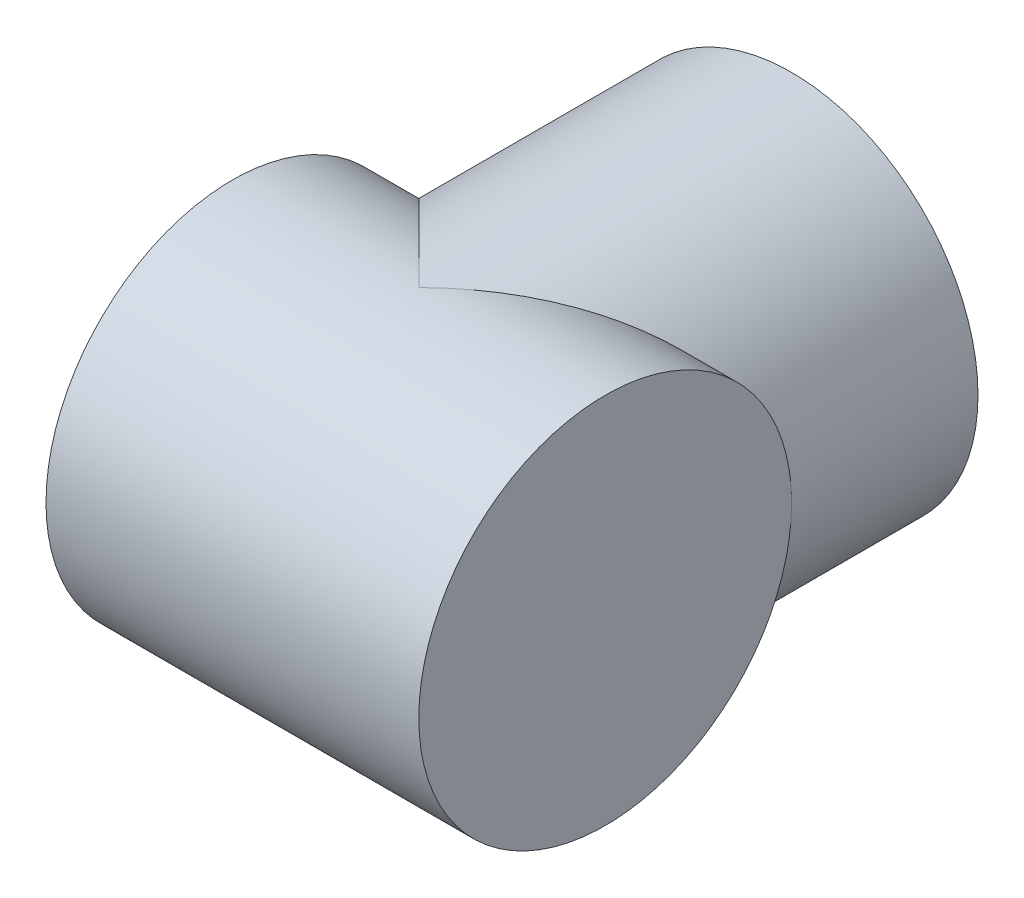
ISO-10303-21;
HEADER;
FILE_DESCRIPTION(('STEP AP214'),'2;1');
FILE_NAME('part.step','',(''),(''),'','','');
FILE_SCHEMA(('AUTOMOTIVE_DESIGN { 1 0 10303 214 1 1 1 1 }'));
ENDSEC;
DATA;
#1=APPLICATION_CONTEXT('core data for automotive mechanical design processes');
#2=APPLICATION_PROTOCOL_DEFINITION('international standard','automotive_design',2000,#1);
#3=PRODUCT_CONTEXT('',#1,'mechanical');
#4=PRODUCT('Part','Part','',(#3));
#5=PRODUCT_RELATED_PRODUCT_CATEGORY('part','',(#4));
#6=PRODUCT_DEFINITION_FORMATION('','',#4);
#7=PRODUCT_DEFINITION_CONTEXT('part definition',#1,'design');
#8=PRODUCT_DEFINITION('design','',#6,#7);
#9=PRODUCT_DEFINITION_SHAPE('','',#8);
#10=(LENGTH_UNIT() NAMED_UNIT(*) SI_UNIT(.MILLI.,.METRE.));
#11=(NAMED_UNIT(*) PLANE_ANGLE_UNIT() SI_UNIT($,.RADIAN.));
#12=(NAMED_UNIT(*) SI_UNIT($,.STERADIAN.) SOLID_ANGLE_UNIT());
#13=UNCERTAINTY_MEASURE_WITH_UNIT(LENGTH_MEASURE(1.E-05),#10,'distance_accuracy_value','');
#14=(GEOMETRIC_REPRESENTATION_CONTEXT(3) GLOBAL_UNCERTAINTY_ASSIGNED_CONTEXT((#13)) GLOBAL_UNIT_ASSIGNED_CONTEXT((#10,
#11,#12)) REPRESENTATION_CONTEXT('',''));
#15=CARTESIAN_POINT('',(0.,0.,0.));
#16=DIRECTION('',(0.,0.,1.));
#17=DIRECTION('',(1.,0.,0.));
#18=AXIS2_PLACEMENT_3D('',#15,#16,#17);
#19=CARTESIAN_POINT('',(150.,0.,0.));
#20=DIRECTION('',(-1.,0.,0.));
#21=DIRECTION('',(0.,0.,1.));
#22=AXIS2_PLACEMENT_3D('',#19,#20,#21);
#23=CYLINDRICAL_SURFACE('',#22,150.);
#24=CARTESIAN_POINT('',(0.,0.,0.));
#25=DIRECTION('',(-0.707106781186547,0.,-0.707106781186547));
#26=DIRECTION('',(-0.707106781186547,0.,0.707106781186547));
#27=AXIS2_PLACEMENT_3D('',#24,#25,#26);
#28=ELLIPSE('',#27,212.132034355964,150.);
#29=CARTESIAN_POINT('',(150.,0.,-150.));
#30=VERTEX_POINT('',#29);
#31=CARTESIAN_POINT('',(0.,150.,0.));
#32=VERTEX_POINT('',#31);
#33=EDGE_CURVE('E53',#30,#32,#28,.F.);
#34=ORIENTED_EDGE('',*,*,#33,.T.);
#35=CARTESIAN_POINT('',(0.,0.,0.));
#36=DIRECTION('',(-0.707106781186547,0.,0.707106781186547));
#37=DIRECTION('',(-0.707106781186547,0.,-0.707106781186547));
#38=AXIS2_PLACEMENT_3D('',#35,#36,#37);
#39=ELLIPSE('',#38,212.132034355964,150.);
#40=CARTESIAN_POINT('',(-150.,0.,-150.));
#41=VERTEX_POINT('',#40);
#42=EDGE_CURVE('E49',#32,#41,#39,.T.);
#43=ORIENTED_EDGE('',*,*,#42,.T.);
#44=CARTESIAN_POINT('',(-150.,0.,0.));
#45=DIRECTION('',(1.,0.,0.));
#46=DIRECTION('',(0.,0.,-1.));
#47=AXIS2_PLACEMENT_3D('',#44,#45,#46);
#48=CIRCLE('',#47,150.);
#49=EDGE_CURVE('E38',#41,#41,#48,.T.);
#50=ORIENTED_EDGE('',*,*,#49,.T.);
#51=CARTESIAN_POINT('',(0.,-150.,0.));
#52=VERTEX_POINT('',#51);
#53=EDGE_CURVE('E61',#41,#52,#39,.T.);
#54=ORIENTED_EDGE('',*,*,#53,.T.);
#55=EDGE_CURVE('E58',#52,#30,#28,.F.);
#56=ORIENTED_EDGE('',*,*,#55,.T.);
#57=CARTESIAN_POINT('',(150.,0.,0.));
#58=DIRECTION('',(1.,0.,0.));
#59=DIRECTION('',(0.,0.,-1.));
#60=AXIS2_PLACEMENT_3D('',#57,#58,#59);
#61=CIRCLE('',#60,150.);
#62=EDGE_CURVE('E11',#30,#30,#61,.T.);
#63=ORIENTED_EDGE('',*,*,#62,.F.);
#64=EDGE_LOOP('',(#34,#43,#50,#54,#56,#63));
#65=FACE_BOUND('',#64,.T.);
#66=ADVANCED_FACE('F35',(#65),#23,.T.);
#67=CARTESIAN_POINT('',(150.,0.,0.));
#68=DIRECTION('',(1.,0.,0.));
#69=DIRECTION('',(0.,0.,-1.));
#70=AXIS2_PLACEMENT_3D('',#67,#68,#69);
#71=PLANE('',#70);
#72=ORIENTED_EDGE('',*,*,#62,.T.);
#73=EDGE_LOOP('',(#72));
#74=FACE_BOUND('',#73,.T.);
#75=ADVANCED_FACE('F72',(#74),#71,.T.);
#76=CARTESIAN_POINT('',(-150.,0.,0.));
#77=DIRECTION('',(1.,0.,0.));
#78=DIRECTION('',(0.,0.,-1.));
#79=AXIS2_PLACEMENT_3D('',#76,#77,#78);
#80=PLANE('',#79);
#81=ORIENTED_EDGE('',*,*,#49,.F.);
#82=EDGE_LOOP('',(#81));
#83=FACE_BOUND('',#82,.T.);
#84=ADVANCED_FACE('F74',(#83),#80,.F.);
#85=CARTESIAN_POINT('',(0.,0.,-300.));
#86=DIRECTION('',(0.,0.,1.));
#87=DIRECTION('',(1.,0.,0.));
#88=AXIS2_PLACEMENT_3D('',#85,#86,#87);
#89=CYLINDRICAL_SURFACE('',#88,150.);
#90=CARTESIAN_POINT('',(0.,0.,-300.));
#91=DIRECTION('',(0.,0.,1.));
#92=DIRECTION('',(1.,0.,0.));
#93=AXIS2_PLACEMENT_3D('',#90,#91,#92);
#94=CIRCLE('',#93,150.);
#95=CARTESIAN_POINT('',(150.,0.,-300.));
#96=VERTEX_POINT('',#95);
#97=EDGE_CURVE('E67',#96,#96,#94,.T.);
#98=ORIENTED_EDGE('',*,*,#97,.T.);
#99=EDGE_LOOP('',(#98));
#100=FACE_BOUND('',#99,.T.);
#101=ORIENTED_EDGE('',*,*,#42,.F.);
#102=ORIENTED_EDGE('',*,*,#33,.F.);
#103=ORIENTED_EDGE('',*,*,#55,.F.);
#104=ORIENTED_EDGE('',*,*,#53,.F.);
#105=EDGE_LOOP('',(#101,#102,#103,#104));
#106=FACE_BOUND('',#105,.T.);
#107=ADVANCED_FACE('F60',(#100,#106),#89,.T.);
#108=CARTESIAN_POINT('',(0.,0.,-300.));
#109=DIRECTION('',(0.,0.,1.));
#110=DIRECTION('',(1.,0.,0.));
#111=AXIS2_PLACEMENT_3D('',#108,#109,#110);
#112=PLANE('',#111);
#113=ORIENTED_EDGE('',*,*,#97,.F.);
#114=EDGE_LOOP('',(#113));
#115=FACE_BOUND('',#114,.T.);
#116=ADVANCED_FACE('F84',(#115),#112,.F.);
#117=CLOSED_SHELL('',(#66,#75,#84,#107,#116));
#118=MANIFOLD_SOLID_BREP('B2',#117);
#119=ADVANCED_BREP_SHAPE_REPRESENTATION('',(#18,#118),#14);
#120=SHAPE_DEFINITION_REPRESENTATION(#9,#119);
ENDSEC;
END-ISO-10303-21;
